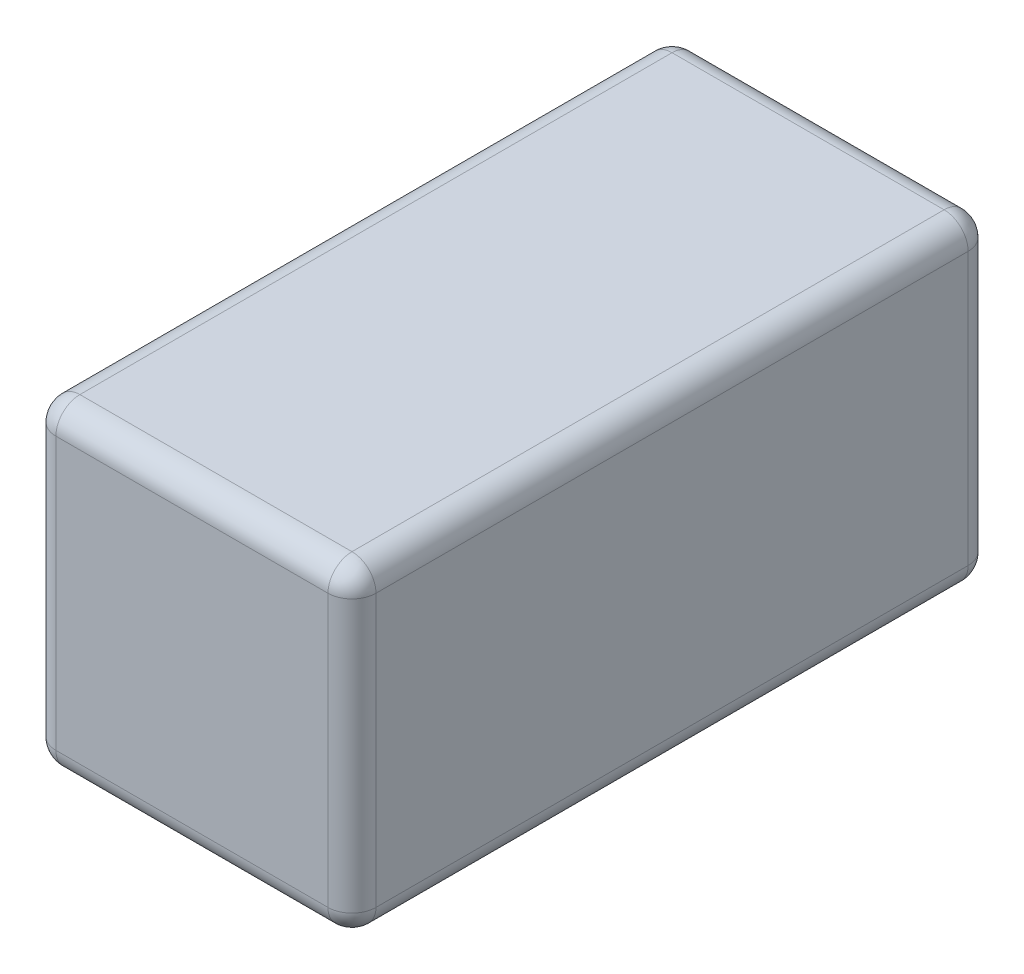
ISO-10303-21;
HEADER;
FILE_DESCRIPTION(('STEP AP214'),'2;1');
FILE_NAME('part.step','',(''),(''),'','','');
FILE_SCHEMA(('AUTOMOTIVE_DESIGN { 1 0 10303 214 1 1 1 1 }'));
ENDSEC;
DATA;
#1=APPLICATION_CONTEXT('core data for automotive mechanical design processes');
#2=APPLICATION_PROTOCOL_DEFINITION('international standard','automotive_design',2000,#1);
#3=PRODUCT_CONTEXT('',#1,'mechanical');
#4=PRODUCT('Part','Part','',(#3));
#5=PRODUCT_RELATED_PRODUCT_CATEGORY('part','',(#4));
#6=PRODUCT_DEFINITION_FORMATION('','',#4);
#7=PRODUCT_DEFINITION_CONTEXT('part definition',#1,'design');
#8=PRODUCT_DEFINITION('design','',#6,#7);
#9=PRODUCT_DEFINITION_SHAPE('','',#8);
#10=(LENGTH_UNIT() NAMED_UNIT(*) SI_UNIT(.MILLI.,.METRE.));
#11=(NAMED_UNIT(*) PLANE_ANGLE_UNIT() SI_UNIT($,.RADIAN.));
#12=(NAMED_UNIT(*) SI_UNIT($,.STERADIAN.) SOLID_ANGLE_UNIT());
#13=UNCERTAINTY_MEASURE_WITH_UNIT(LENGTH_MEASURE(1.E-05),#10,'distance_accuracy_value','');
#14=(GEOMETRIC_REPRESENTATION_CONTEXT(3) GLOBAL_UNCERTAINTY_ASSIGNED_CONTEXT((#13)) GLOBAL_UNIT_ASSIGNED_CONTEXT((#10,
#11,#12)) REPRESENTATION_CONTEXT('',''));
#15=CARTESIAN_POINT('',(0.,0.,0.));
#16=DIRECTION('',(0.,0.,1.));
#17=DIRECTION('',(1.,0.,0.));
#18=AXIS2_PLACEMENT_3D('',#15,#16,#17);
#19=CARTESIAN_POINT('',(0.,0.,8.));
#20=DIRECTION('',(1.,0.,0.));
#21=DIRECTION('',(0.,0.,-1.));
#22=AXIS2_PLACEMENT_3D('',#19,#20,#21);
#23=PLANE('',#22);
#24=DIRECTION('',(0.,0.,-1.));
#25=VECTOR('',#24,1.);
#26=CARTESIAN_POINT('',(0.,0.3,8.));
#27=LINE('',#26,#25);
#28=CARTESIAN_POINT('',(0.,0.3,0.3));
#29=VERTEX_POINT('',#28);
#30=CARTESIAN_POINT('',(0.,0.3,7.7));
#31=VERTEX_POINT('',#30);
#32=EDGE_CURVE('E191',#29,#31,#27,.F.);
#33=ORIENTED_EDGE('',*,*,#32,.T.);
#34=DIRECTION('',(0.,-1.,0.));
#35=VECTOR('',#34,1.);
#36=CARTESIAN_POINT('',(0.,0.,7.7));
#37=LINE('',#36,#35);
#38=CARTESIAN_POINT('',(0.,3.7,7.7));
#39=VERTEX_POINT('',#38);
#40=EDGE_CURVE('E11',#31,#39,#37,.F.);
#41=ORIENTED_EDGE('',*,*,#40,.T.);
#42=DIRECTION('',(0.,0.,-1.));
#43=VECTOR('',#42,1.);
#44=CARTESIAN_POINT('',(0.,3.7,8.));
#45=LINE('',#44,#43);
#46=CARTESIAN_POINT('',(0.,3.7,0.3));
#47=VERTEX_POINT('',#46);
#48=EDGE_CURVE('E230',#39,#47,#45,.T.);
#49=ORIENTED_EDGE('',*,*,#48,.T.);
#50=DIRECTION('',(0.,-1.,0.));
#51=VECTOR('',#50,1.);
#52=CARTESIAN_POINT('',(0.,0.3,0.3));
#53=LINE('',#52,#51);
#54=EDGE_CURVE('E188',#47,#29,#53,.T.);
#55=ORIENTED_EDGE('',*,*,#54,.T.);
#56=EDGE_LOOP('',(#33,#41,#49,#55));
#57=FACE_BOUND('',#56,.T.);
#58=ADVANCED_FACE('F41',(#57),#23,.F.);
#59=CARTESIAN_POINT('',(0.,0.,8.));
#60=DIRECTION('',(0.,1.,0.));
#61=DIRECTION('',(0.,0.,1.));
#62=AXIS2_PLACEMENT_3D('',#59,#60,#61);
#63=PLANE('',#62);
#64=DIRECTION('',(0.,0.,-1.));
#65=VECTOR('',#64,1.);
#66=CARTESIAN_POINT('',(3.7,0.,8.));
#67=LINE('',#66,#65);
#68=CARTESIAN_POINT('',(3.7,0.,0.3));
#69=VERTEX_POINT('',#68);
#70=CARTESIAN_POINT('',(3.7,0.,7.7));
#71=VERTEX_POINT('',#70);
#72=EDGE_CURVE('E145',#69,#71,#67,.F.);
#73=ORIENTED_EDGE('',*,*,#72,.T.);
#74=DIRECTION('',(1.,0.,0.));
#75=VECTOR('',#74,1.);
#76=CARTESIAN_POINT('',(0.,0.,7.7));
#77=LINE('',#76,#75);
#78=CARTESIAN_POINT('',(0.3,0.,7.7));
#79=VERTEX_POINT('',#78);
#80=EDGE_CURVE('E66',#71,#79,#77,.F.);
#81=ORIENTED_EDGE('',*,*,#80,.T.);
#82=DIRECTION('',(0.,0.,-1.));
#83=VECTOR('',#82,1.);
#84=CARTESIAN_POINT('',(0.3,0.,8.));
#85=LINE('',#84,#83);
#86=CARTESIAN_POINT('',(0.3,0.,0.3));
#87=VERTEX_POINT('',#86);
#88=EDGE_CURVE('E184',#79,#87,#85,.T.);
#89=ORIENTED_EDGE('',*,*,#88,.T.);
#90=DIRECTION('',(1.,0.,0.));
#91=VECTOR('',#90,1.);
#92=CARTESIAN_POINT('',(4.,0.,0.3));
#93=LINE('',#92,#91);
#94=EDGE_CURVE('E165',#87,#69,#93,.T.);
#95=ORIENTED_EDGE('',*,*,#94,.T.);
#96=EDGE_LOOP('',(#73,#81,#89,#95));
#97=FACE_BOUND('',#96,.T.);
#98=ADVANCED_FACE('F315',(#97),#63,.F.);
#99=CARTESIAN_POINT('',(4.,0.,8.));
#100=DIRECTION('',(-1.,0.,0.));
#101=DIRECTION('',(0.,0.,1.));
#102=AXIS2_PLACEMENT_3D('',#99,#100,#101);
#103=PLANE('',#102);
#104=DIRECTION('',(0.,0.,-1.));
#105=VECTOR('',#104,1.);
#106=CARTESIAN_POINT('',(4.,3.7,8.));
#107=LINE('',#106,#105);
#108=CARTESIAN_POINT('',(4.,3.7,0.3));
#109=VERTEX_POINT('',#108);
#110=CARTESIAN_POINT('',(4.,3.7,7.7));
#111=VERTEX_POINT('',#110);
#112=EDGE_CURVE('E219',#109,#111,#107,.F.);
#113=ORIENTED_EDGE('',*,*,#112,.T.);
#114=DIRECTION('',(0.,1.,0.));
#115=VECTOR('',#114,1.);
#116=CARTESIAN_POINT('',(4.,0.,7.7));
#117=LINE('',#116,#115);
#118=CARTESIAN_POINT('',(4.,0.3,7.7));
#119=VERTEX_POINT('',#118);
#120=EDGE_CURVE('E141',#111,#119,#117,.F.);
#121=ORIENTED_EDGE('',*,*,#120,.T.);
#122=DIRECTION('',(0.,0.,-1.));
#123=VECTOR('',#122,1.);
#124=CARTESIAN_POINT('',(4.,0.3,8.));
#125=LINE('',#124,#123);
#126=CARTESIAN_POINT('',(4.,0.3,0.3));
#127=VERTEX_POINT('',#126);
#128=EDGE_CURVE('E133',#119,#127,#125,.T.);
#129=ORIENTED_EDGE('',*,*,#128,.T.);
#130=DIRECTION('',(0.,1.,0.));
#131=VECTOR('',#130,1.);
#132=CARTESIAN_POINT('',(4.,4.,0.3));
#133=LINE('',#132,#131);
#134=EDGE_CURVE('E138',#127,#109,#133,.T.);
#135=ORIENTED_EDGE('',*,*,#134,.T.);
#136=EDGE_LOOP('',(#113,#121,#129,#135));
#137=FACE_BOUND('',#136,.T.);
#138=ADVANCED_FACE('F136',(#137),#103,.F.);
#139=CARTESIAN_POINT('',(0.,4.,8.));
#140=DIRECTION('',(0.,-1.,0.));
#141=DIRECTION('',(0.,0.,-1.));
#142=AXIS2_PLACEMENT_3D('',#139,#140,#141);
#143=PLANE('',#142);
#144=DIRECTION('',(0.,0.,-1.));
#145=VECTOR('',#144,1.);
#146=CARTESIAN_POINT('',(0.3,4.,8.));
#147=LINE('',#146,#145);
#148=CARTESIAN_POINT('',(0.3,4.,0.3));
#149=VERTEX_POINT('',#148);
#150=CARTESIAN_POINT('',(0.3,4.,7.7));
#151=VERTEX_POINT('',#150);
#152=EDGE_CURVE('E201',#149,#151,#147,.F.);
#153=ORIENTED_EDGE('',*,*,#152,.T.);
#154=DIRECTION('',(-1.,0.,0.));
#155=VECTOR('',#154,1.);
#156=CARTESIAN_POINT('',(0.,4.,7.7));
#157=LINE('',#156,#155);
#158=CARTESIAN_POINT('',(3.7,4.,7.7));
#159=VERTEX_POINT('',#158);
#160=EDGE_CURVE('E265',#151,#159,#157,.F.);
#161=ORIENTED_EDGE('',*,*,#160,.T.);
#162=DIRECTION('',(0.,0.,-1.));
#163=VECTOR('',#162,1.);
#164=CARTESIAN_POINT('',(3.7,4.,8.));
#165=LINE('',#164,#163);
#166=CARTESIAN_POINT('',(3.7,4.,0.3));
#167=VERTEX_POINT('',#166);
#168=EDGE_CURVE('E216',#159,#167,#165,.T.);
#169=ORIENTED_EDGE('',*,*,#168,.T.);
#170=DIRECTION('',(-1.,0.,0.));
#171=VECTOR('',#170,1.);
#172=CARTESIAN_POINT('',(0.3,4.,0.3));
#173=LINE('',#172,#171);
#174=EDGE_CURVE('E213',#167,#149,#173,.T.);
#175=ORIENTED_EDGE('',*,*,#174,.T.);
#176=EDGE_LOOP('',(#153,#161,#169,#175));
#177=FACE_BOUND('',#176,.T.);
#178=ADVANCED_FACE('F361',(#177),#143,.F.);
#179=CARTESIAN_POINT('',(0.,0.,8.));
#180=DIRECTION('',(0.,0.,-1.));
#181=DIRECTION('',(-1.,0.,0.));
#182=AXIS2_PLACEMENT_3D('',#179,#180,#181);
#183=PLANE('',#182);
#184=DIRECTION('',(0.,1.,0.));
#185=VECTOR('',#184,1.);
#186=CARTESIAN_POINT('',(3.7,0.,8.));
#187=LINE('',#186,#185);
#188=CARTESIAN_POINT('',(3.7,0.3,8.));
#189=VERTEX_POINT('',#188);
#190=CARTESIAN_POINT('',(3.7,3.7,8.));
#191=VERTEX_POINT('',#190);
#192=EDGE_CURVE('E258',#189,#191,#187,.T.);
#193=ORIENTED_EDGE('',*,*,#192,.T.);
#194=DIRECTION('',(-1.,0.,0.));
#195=VECTOR('',#194,1.);
#196=CARTESIAN_POINT('',(0.,3.7,8.));
#197=LINE('',#196,#195);
#198=CARTESIAN_POINT('',(0.3,3.7,8.));
#199=VERTEX_POINT('',#198);
#200=EDGE_CURVE('E261',#191,#199,#197,.T.);
#201=ORIENTED_EDGE('',*,*,#200,.T.);
#202=DIRECTION('',(0.,-1.,0.));
#203=VECTOR('',#202,1.);
#204=CARTESIAN_POINT('',(0.3,0.,8.));
#205=LINE('',#204,#203);
#206=CARTESIAN_POINT('',(0.3,0.3,8.));
#207=VERTEX_POINT('',#206);
#208=EDGE_CURVE('E252',#199,#207,#205,.T.);
#209=ORIENTED_EDGE('',*,*,#208,.T.);
#210=DIRECTION('',(1.,0.,0.));
#211=VECTOR('',#210,1.);
#212=CARTESIAN_POINT('',(0.,0.3,8.));
#213=LINE('',#212,#211);
#214=EDGE_CURVE('E255',#207,#189,#213,.T.);
#215=ORIENTED_EDGE('',*,*,#214,.T.);
#216=EDGE_LOOP('',(#193,#201,#209,#215));
#217=FACE_BOUND('',#216,.T.);
#218=ADVANCED_FACE('F460',(#217),#183,.F.);
#219=CARTESIAN_POINT('',(0.,0.,0.));
#220=DIRECTION('',(0.,0.,-1.));
#221=DIRECTION('',(-1.,0.,0.));
#222=AXIS2_PLACEMENT_3D('',#219,#220,#221);
#223=PLANE('',#222);
#224=DIRECTION('',(0.,-1.,0.));
#225=VECTOR('',#224,1.);
#226=CARTESIAN_POINT('',(0.3,4.,0.));
#227=LINE('',#226,#225);
#228=CARTESIAN_POINT('',(0.3,0.3,0.));
#229=VERTEX_POINT('',#228);
#230=CARTESIAN_POINT('',(0.3,3.7,0.));
#231=VERTEX_POINT('',#230);
#232=EDGE_CURVE('E197',#229,#231,#227,.F.);
#233=ORIENTED_EDGE('',*,*,#232,.T.);
#234=DIRECTION('',(-1.,0.,0.));
#235=VECTOR('',#234,1.);
#236=CARTESIAN_POINT('',(3.7,3.7,0.));
#237=LINE('',#236,#235);
#238=CARTESIAN_POINT('',(3.7,3.7,0.));
#239=VERTEX_POINT('',#238);
#240=EDGE_CURVE('E224',#231,#239,#237,.F.);
#241=ORIENTED_EDGE('',*,*,#240,.T.);
#242=DIRECTION('',(0.,1.,0.));
#243=VECTOR('',#242,1.);
#244=CARTESIAN_POINT('',(3.7,0.3,0.));
#245=LINE('',#244,#243);
#246=CARTESIAN_POINT('',(3.7,0.3,0.));
#247=VERTEX_POINT('',#246);
#248=EDGE_CURVE('E182',#239,#247,#245,.F.);
#249=ORIENTED_EDGE('',*,*,#248,.T.);
#250=DIRECTION('',(1.,0.,0.));
#251=VECTOR('',#250,1.);
#252=CARTESIAN_POINT('',(0.,0.3,0.));
#253=LINE('',#252,#251);
#254=EDGE_CURVE('E171',#247,#229,#253,.F.);
#255=ORIENTED_EDGE('',*,*,#254,.T.);
#256=EDGE_LOOP('',(#233,#241,#249,#255));
#257=FACE_BOUND('',#256,.T.);
#258=ADVANCED_FACE('F324',(#257),#223,.T.);
#259=CARTESIAN_POINT('',(0.,0.3,0.3));
#260=DIRECTION('',(-1.,0.,0.));
#261=DIRECTION('',(0.,0.,1.));
#262=AXIS2_PLACEMENT_3D('',#259,#260,#261);
#263=CYLINDRICAL_SURFACE('',#262,0.3);
#264=ORIENTED_EDGE('',*,*,#94,.F.);
#265=CARTESIAN_POINT('',(0.3,0.3,0.3));
#266=DIRECTION('',(-1.,0.,0.));
#267=DIRECTION('',(0.,0.,1.));
#268=AXIS2_PLACEMENT_3D('',#265,#266,#267);
#269=CIRCLE('',#268,0.3);
#270=EDGE_CURVE('E194',#87,#229,#269,.F.);
#271=ORIENTED_EDGE('',*,*,#270,.T.);
#272=ORIENTED_EDGE('',*,*,#254,.F.);
#273=CARTESIAN_POINT('',(3.7,0.3,0.3));
#274=DIRECTION('',(-1.,0.,0.));
#275=DIRECTION('',(0.,0.,1.));
#276=AXIS2_PLACEMENT_3D('',#273,#274,#275);
#277=CIRCLE('',#276,0.3);
#278=EDGE_CURVE('E161',#247,#69,#277,.T.);
#279=ORIENTED_EDGE('',*,*,#278,.T.);
#280=EDGE_LOOP('',(#264,#271,#272,#279));
#281=FACE_BOUND('',#280,.T.);
#282=ADVANCED_FACE('F320',(#281),#263,.T.);
#283=CARTESIAN_POINT('',(3.7,0.,0.3));
#284=DIRECTION('',(0.,-1.,0.));
#285=DIRECTION('',(0.,0.,-1.));
#286=AXIS2_PLACEMENT_3D('',#283,#284,#285);
#287=CYLINDRICAL_SURFACE('',#286,0.3);
#288=ORIENTED_EDGE('',*,*,#248,.F.);
#289=CARTESIAN_POINT('',(3.7,3.7,0.3));
#290=DIRECTION('',(0.,-1.,0.));
#291=DIRECTION('',(0.,0.,-1.));
#292=AXIS2_PLACEMENT_3D('',#289,#290,#291);
#293=CIRCLE('',#292,0.3);
#294=EDGE_CURVE('E169',#239,#109,#293,.T.);
#295=ORIENTED_EDGE('',*,*,#294,.T.);
#296=ORIENTED_EDGE('',*,*,#134,.F.);
#297=CARTESIAN_POINT('',(3.7,0.3,0.3));
#298=DIRECTION('',(0.,-1.,0.));
#299=DIRECTION('',(0.,0.,-1.));
#300=AXIS2_PLACEMENT_3D('',#297,#298,#299);
#301=CIRCLE('',#300,0.3);
#302=EDGE_CURVE('E155',#247,#127,#301,.T.);
#303=ORIENTED_EDGE('',*,*,#302,.F.);
#304=EDGE_LOOP('',(#288,#295,#296,#303));
#305=FACE_BOUND('',#304,.T.);
#306=ADVANCED_FACE('F167',(#305),#287,.T.);
#307=CARTESIAN_POINT('',(3.7,0.3,0.3));
#308=DIRECTION('',(-1.,0.,0.));
#309=DIRECTION('',(0.,0.,1.));
#310=AXIS2_PLACEMENT_3D('',#307,#308,#309);
#311=SPHERICAL_SURFACE('',#310,0.3);
#312=ORIENTED_EDGE('',*,*,#278,.F.);
#313=ORIENTED_EDGE('',*,*,#302,.T.);
#314=CARTESIAN_POINT('',(3.7,0.3,0.3));
#315=DIRECTION('',(0.,0.,1.));
#316=DIRECTION('',(1.,0.,0.));
#317=AXIS2_PLACEMENT_3D('',#314,#315,#316);
#318=CIRCLE('',#317,0.3);
#319=EDGE_CURVE('E149',#69,#127,#318,.T.);
#320=ORIENTED_EDGE('',*,*,#319,.F.);
#321=EDGE_LOOP('',(#312,#313,#320));
#322=FACE_BOUND('',#321,.T.);
#323=ADVANCED_FACE('F159',(#322),#311,.T.);
#324=CARTESIAN_POINT('',(3.7,0.3,8.));
#325=DIRECTION('',(0.,0.,-1.));
#326=DIRECTION('',(-1.,0.,0.));
#327=AXIS2_PLACEMENT_3D('',#324,#325,#326);
#328=CYLINDRICAL_SURFACE('',#327,0.3);
#329=ORIENTED_EDGE('',*,*,#128,.F.);
#330=CARTESIAN_POINT('',(3.7,0.3,7.7));
#331=DIRECTION('',(0.,0.,-1.));
#332=DIRECTION('',(-1.,0.,0.));
#333=AXIS2_PLACEMENT_3D('',#330,#331,#332);
#334=CIRCLE('',#333,0.3);
#335=EDGE_CURVE('E273',#119,#71,#334,.T.);
#336=ORIENTED_EDGE('',*,*,#335,.T.);
#337=ORIENTED_EDGE('',*,*,#72,.F.);
#338=ORIENTED_EDGE('',*,*,#319,.T.);
#339=EDGE_LOOP('',(#329,#336,#337,#338));
#340=FACE_BOUND('',#339,.T.);
#341=ADVANCED_FACE('F151',(#340),#328,.T.);
#342=CARTESIAN_POINT('',(0.3,0.,0.3));
#343=DIRECTION('',(0.,1.,0.));
#344=DIRECTION('',(0.,0.,1.));
#345=AXIS2_PLACEMENT_3D('',#342,#343,#344);
#346=CYLINDRICAL_SURFACE('',#345,0.3);
#347=ORIENTED_EDGE('',*,*,#54,.F.);
#348=CARTESIAN_POINT('',(0.3,3.7,0.3));
#349=DIRECTION('',(0.,1.,0.));
#350=DIRECTION('',(0.,0.,1.));
#351=AXIS2_PLACEMENT_3D('',#348,#349,#350);
#352=CIRCLE('',#351,0.3);
#353=EDGE_CURVE('E227',#47,#231,#352,.F.);
#354=ORIENTED_EDGE('',*,*,#353,.T.);
#355=ORIENTED_EDGE('',*,*,#232,.F.);
#356=CARTESIAN_POINT('',(0.3,0.3,0.3));
#357=DIRECTION('',(0.,-1.,0.));
#358=DIRECTION('',(0.,0.,-1.));
#359=AXIS2_PLACEMENT_3D('',#356,#357,#358);
#360=CIRCLE('',#359,0.3);
#361=EDGE_CURVE('E156',#29,#229,#360,.T.);
#362=ORIENTED_EDGE('',*,*,#361,.F.);
#363=EDGE_LOOP('',(#347,#354,#355,#362));
#364=FACE_BOUND('',#363,.T.);
#365=ADVANCED_FACE('F329',(#364),#346,.T.);
#366=CARTESIAN_POINT('',(0.3,0.3,0.3));
#367=DIRECTION('',(1.,0.,0.));
#368=DIRECTION('',(0.,0.,-1.));
#369=AXIS2_PLACEMENT_3D('',#366,#367,#368);
#370=SPHERICAL_SURFACE('',#369,0.3);
#371=ORIENTED_EDGE('',*,*,#361,.T.);
#372=ORIENTED_EDGE('',*,*,#270,.F.);
#373=CARTESIAN_POINT('',(0.3,0.3,0.3));
#374=DIRECTION('',(0.,0.,1.));
#375=DIRECTION('',(1.,0.,0.));
#376=AXIS2_PLACEMENT_3D('',#373,#374,#375);
#377=CIRCLE('',#376,0.3);
#378=EDGE_CURVE('E202',#29,#87,#377,.T.);
#379=ORIENTED_EDGE('',*,*,#378,.F.);
#380=EDGE_LOOP('',(#371,#372,#379));
#381=FACE_BOUND('',#380,.T.);
#382=ADVANCED_FACE('F333',(#381),#370,.T.);
#383=CARTESIAN_POINT('',(0.3,0.3,8.));
#384=DIRECTION('',(0.,0.,-1.));
#385=DIRECTION('',(-1.,0.,0.));
#386=AXIS2_PLACEMENT_3D('',#383,#384,#385);
#387=CYLINDRICAL_SURFACE('',#386,0.3);
#388=ORIENTED_EDGE('',*,*,#88,.F.);
#389=CARTESIAN_POINT('',(0.3,0.3,7.7));
#390=DIRECTION('',(0.,0.,-1.));
#391=DIRECTION('',(-1.,0.,0.));
#392=AXIS2_PLACEMENT_3D('',#389,#390,#391);
#393=CIRCLE('',#392,0.3);
#394=EDGE_CURVE('E51',#79,#31,#393,.T.);
#395=ORIENTED_EDGE('',*,*,#394,.T.);
#396=ORIENTED_EDGE('',*,*,#32,.F.);
#397=ORIENTED_EDGE('',*,*,#378,.T.);
#398=EDGE_LOOP('',(#388,#395,#396,#397));
#399=FACE_BOUND('',#398,.T.);
#400=ADVANCED_FACE('F334',(#399),#387,.T.);
#401=CARTESIAN_POINT('',(0.3,3.7,8.));
#402=DIRECTION('',(0.,0.,-1.));
#403=DIRECTION('',(-1.,0.,0.));
#404=AXIS2_PLACEMENT_3D('',#401,#402,#403);
#405=CYLINDRICAL_SURFACE('',#404,0.3);
#406=ORIENTED_EDGE('',*,*,#48,.F.);
#407=CARTESIAN_POINT('',(0.3,3.7,7.7));
#408=DIRECTION('',(0.,0.,-1.));
#409=DIRECTION('',(-1.,0.,0.));
#410=AXIS2_PLACEMENT_3D('',#407,#408,#409);
#411=CIRCLE('',#410,0.3);
#412=EDGE_CURVE('E233',#39,#151,#411,.T.);
#413=ORIENTED_EDGE('',*,*,#412,.T.);
#414=ORIENTED_EDGE('',*,*,#152,.F.);
#415=CARTESIAN_POINT('',(0.3,3.7,0.3));
#416=DIRECTION('',(0.,0.,-1.));
#417=DIRECTION('',(-1.,0.,0.));
#418=AXIS2_PLACEMENT_3D('',#415,#416,#417);
#419=CIRCLE('',#418,0.3);
#420=EDGE_CURVE('E206',#47,#149,#419,.T.);
#421=ORIENTED_EDGE('',*,*,#420,.F.);
#422=EDGE_LOOP('',(#406,#413,#414,#421));
#423=FACE_BOUND('',#422,.T.);
#424=ADVANCED_FACE('F359',(#423),#405,.T.);
#425=CARTESIAN_POINT('',(0.3,3.7,0.3));
#426=DIRECTION('',(0.,-1.,0.));
#427=DIRECTION('',(0.,0.,-1.));
#428=AXIS2_PLACEMENT_3D('',#425,#426,#427);
#429=SPHERICAL_SURFACE('',#428,0.3);
#430=ORIENTED_EDGE('',*,*,#353,.F.);
#431=ORIENTED_EDGE('',*,*,#420,.T.);
#432=CARTESIAN_POINT('',(0.3,3.7,0.3));
#433=DIRECTION('',(1.,0.,0.));
#434=DIRECTION('',(0.,0.,-1.));
#435=AXIS2_PLACEMENT_3D('',#432,#433,#434);
#436=CIRCLE('',#435,0.3);
#437=EDGE_CURVE('E242',#231,#149,#436,.T.);
#438=ORIENTED_EDGE('',*,*,#437,.F.);
#439=EDGE_LOOP('',(#430,#431,#438));
#440=FACE_BOUND('',#439,.T.);
#441=ADVANCED_FACE('F368',(#440),#429,.T.);
#442=CARTESIAN_POINT('',(0.,3.7,0.3));
#443=DIRECTION('',(1.,0.,0.));
#444=DIRECTION('',(0.,0.,-1.));
#445=AXIS2_PLACEMENT_3D('',#442,#443,#444);
#446=CYLINDRICAL_SURFACE('',#445,0.3);
#447=CARTESIAN_POINT('',(3.7,3.7,0.3));
#448=DIRECTION('',(1.,0.,0.));
#449=DIRECTION('',(0.,0.,-1.));
#450=AXIS2_PLACEMENT_3D('',#447,#448,#449);
#451=CIRCLE('',#450,0.3);
#452=EDGE_CURVE('E238',#239,#167,#451,.T.);
#453=ORIENTED_EDGE('',*,*,#452,.F.);
#454=ORIENTED_EDGE('',*,*,#240,.F.);
#455=ORIENTED_EDGE('',*,*,#437,.T.);
#456=ORIENTED_EDGE('',*,*,#174,.F.);
#457=EDGE_LOOP('',(#453,#454,#455,#456));
#458=FACE_BOUND('',#457,.T.);
#459=ADVANCED_FACE('F365',(#458),#446,.T.);
#460=CARTESIAN_POINT('',(3.7,3.7,0.3));
#461=DIRECTION('',(0.,-1.,0.));
#462=DIRECTION('',(0.,0.,-1.));
#463=AXIS2_PLACEMENT_3D('',#460,#461,#462);
#464=SPHERICAL_SURFACE('',#463,0.3);
#465=ORIENTED_EDGE('',*,*,#294,.F.);
#466=ORIENTED_EDGE('',*,*,#452,.T.);
#467=CARTESIAN_POINT('',(3.7,3.7,0.3));
#468=DIRECTION('',(0.,0.,1.));
#469=DIRECTION('',(1.,0.,0.));
#470=AXIS2_PLACEMENT_3D('',#467,#468,#469);
#471=CIRCLE('',#470,0.3);
#472=EDGE_CURVE('E234',#109,#167,#471,.T.);
#473=ORIENTED_EDGE('',*,*,#472,.F.);
#474=EDGE_LOOP('',(#465,#466,#473));
#475=FACE_BOUND('',#474,.T.);
#476=ADVANCED_FACE('F375',(#475),#464,.T.);
#477=CARTESIAN_POINT('',(3.7,3.7,8.));
#478=DIRECTION('',(0.,0.,-1.));
#479=DIRECTION('',(-1.,0.,0.));
#480=AXIS2_PLACEMENT_3D('',#477,#478,#479);
#481=CYLINDRICAL_SURFACE('',#480,0.3);
#482=ORIENTED_EDGE('',*,*,#168,.F.);
#483=CARTESIAN_POINT('',(3.7,3.7,7.7));
#484=DIRECTION('',(0.,0.,-1.));
#485=DIRECTION('',(-1.,0.,0.));
#486=AXIS2_PLACEMENT_3D('',#483,#484,#485);
#487=CIRCLE('',#486,0.3);
#488=EDGE_CURVE('E268',#159,#111,#487,.T.);
#489=ORIENTED_EDGE('',*,*,#488,.T.);
#490=ORIENTED_EDGE('',*,*,#112,.F.);
#491=ORIENTED_EDGE('',*,*,#472,.T.);
#492=EDGE_LOOP('',(#482,#489,#490,#491));
#493=FACE_BOUND('',#492,.T.);
#494=ADVANCED_FACE('F400',(#493),#481,.T.);
#495=CARTESIAN_POINT('',(3.7,0.3,7.7));
#496=DIRECTION('',(0.,0.,-1.));
#497=DIRECTION('',(-1.,0.,0.));
#498=AXIS2_PLACEMENT_3D('',#495,#496,#497);
#499=SPHERICAL_SURFACE('',#498,0.3);
#500=CARTESIAN_POINT('',(3.7,0.3,7.7));
#501=DIRECTION('',(-1.,0.,0.));
#502=DIRECTION('',(0.,0.,1.));
#503=AXIS2_PLACEMENT_3D('',#500,#501,#502);
#504=CIRCLE('',#503,0.3);
#505=EDGE_CURVE('E301',#71,#189,#504,.T.);
#506=ORIENTED_EDGE('',*,*,#505,.F.);
#507=ORIENTED_EDGE('',*,*,#335,.F.);
#508=CARTESIAN_POINT('',(3.7,0.3,7.7));
#509=DIRECTION('',(0.,1.,0.));
#510=DIRECTION('',(0.,0.,1.));
#511=AXIS2_PLACEMENT_3D('',#508,#509,#510);
#512=CIRCLE('',#511,0.3);
#513=EDGE_CURVE('E45',#189,#119,#512,.T.);
#514=ORIENTED_EDGE('',*,*,#513,.F.);
#515=EDGE_LOOP('',(#506,#507,#514));
#516=FACE_BOUND('',#515,.T.);
#517=ADVANCED_FACE('F43',(#516),#499,.T.);
#518=CARTESIAN_POINT('',(3.7,0.,7.7));
#519=DIRECTION('',(0.,1.,0.));
#520=DIRECTION('',(0.,0.,1.));
#521=AXIS2_PLACEMENT_3D('',#518,#519,#520);
#522=CYLINDRICAL_SURFACE('',#521,0.3);
#523=ORIENTED_EDGE('',*,*,#513,.T.);
#524=ORIENTED_EDGE('',*,*,#120,.F.);
#525=CARTESIAN_POINT('',(3.7,3.7,7.7));
#526=DIRECTION('',(0.,1.,0.));
#527=DIRECTION('',(0.,0.,1.));
#528=AXIS2_PLACEMENT_3D('',#525,#526,#527);
#529=CIRCLE('',#528,0.3);
#530=EDGE_CURVE('E298',#191,#111,#529,.T.);
#531=ORIENTED_EDGE('',*,*,#530,.F.);
#532=ORIENTED_EDGE('',*,*,#192,.F.);
#533=EDGE_LOOP('',(#523,#524,#531,#532));
#534=FACE_BOUND('',#533,.T.);
#535=ADVANCED_FACE('F312',(#534),#522,.T.);
#536=CARTESIAN_POINT('',(0.,0.3,7.7));
#537=DIRECTION('',(1.,0.,0.));
#538=DIRECTION('',(0.,0.,-1.));
#539=AXIS2_PLACEMENT_3D('',#536,#537,#538);
#540=CYLINDRICAL_SURFACE('',#539,0.3);
#541=ORIENTED_EDGE('',*,*,#505,.T.);
#542=ORIENTED_EDGE('',*,*,#214,.F.);
#543=CARTESIAN_POINT('',(0.3,0.3,7.7));
#544=DIRECTION('',(-1.,0.,0.));
#545=DIRECTION('',(0.,0.,1.));
#546=AXIS2_PLACEMENT_3D('',#543,#544,#545);
#547=CIRCLE('',#546,0.3);
#548=EDGE_CURVE('E294',#79,#207,#547,.T.);
#549=ORIENTED_EDGE('',*,*,#548,.F.);
#550=ORIENTED_EDGE('',*,*,#80,.F.);
#551=EDGE_LOOP('',(#541,#542,#549,#550));
#552=FACE_BOUND('',#551,.T.);
#553=ADVANCED_FACE('F413',(#552),#540,.T.);
#554=CARTESIAN_POINT('',(3.7,3.7,7.7));
#555=DIRECTION('',(0.,0.,-1.));
#556=DIRECTION('',(-1.,0.,0.));
#557=AXIS2_PLACEMENT_3D('',#554,#555,#556);
#558=SPHERICAL_SURFACE('',#557,0.3);
#559=ORIENTED_EDGE('',*,*,#530,.T.);
#560=ORIENTED_EDGE('',*,*,#488,.F.);
#561=CARTESIAN_POINT('',(3.7,3.7,7.7));
#562=DIRECTION('',(-1.,0.,0.));
#563=DIRECTION('',(0.,0.,1.));
#564=AXIS2_PLACEMENT_3D('',#561,#562,#563);
#565=CIRCLE('',#564,0.3);
#566=EDGE_CURVE('E290',#191,#159,#565,.T.);
#567=ORIENTED_EDGE('',*,*,#566,.F.);
#568=EDGE_LOOP('',(#559,#560,#567));
#569=FACE_BOUND('',#568,.T.);
#570=ADVANCED_FACE('F411',(#569),#558,.T.);
#571=CARTESIAN_POINT('',(0.3,0.3,7.7));
#572=DIRECTION('',(0.,0.,-1.));
#573=DIRECTION('',(-1.,0.,0.));
#574=AXIS2_PLACEMENT_3D('',#571,#572,#573);
#575=SPHERICAL_SURFACE('',#574,0.3);
#576=ORIENTED_EDGE('',*,*,#394,.F.);
#577=ORIENTED_EDGE('',*,*,#548,.T.);
#578=CARTESIAN_POINT('',(0.3,0.3,7.7));
#579=DIRECTION('',(0.,1.,0.));
#580=DIRECTION('',(0.,0.,1.));
#581=AXIS2_PLACEMENT_3D('',#578,#579,#580);
#582=CIRCLE('',#581,0.3);
#583=EDGE_CURVE('E286',#31,#207,#582,.T.);
#584=ORIENTED_EDGE('',*,*,#583,.F.);
#585=EDGE_LOOP('',(#576,#577,#584));
#586=FACE_BOUND('',#585,.T.);
#587=ADVANCED_FACE('F341',(#586),#575,.T.);
#588=CARTESIAN_POINT('',(0.,3.7,7.7));
#589=DIRECTION('',(-1.,0.,0.));
#590=DIRECTION('',(0.,0.,1.));
#591=AXIS2_PLACEMENT_3D('',#588,#589,#590);
#592=CYLINDRICAL_SURFACE('',#591,0.3);
#593=ORIENTED_EDGE('',*,*,#566,.T.);
#594=ORIENTED_EDGE('',*,*,#160,.F.);
#595=CARTESIAN_POINT('',(0.3,3.7,7.7));
#596=DIRECTION('',(-1.,0.,0.));
#597=DIRECTION('',(0.,0.,1.));
#598=AXIS2_PLACEMENT_3D('',#595,#596,#597);
#599=CIRCLE('',#598,0.3);
#600=EDGE_CURVE('E283',#199,#151,#599,.T.);
#601=ORIENTED_EDGE('',*,*,#600,.F.);
#602=ORIENTED_EDGE('',*,*,#200,.F.);
#603=EDGE_LOOP('',(#593,#594,#601,#602));
#604=FACE_BOUND('',#603,.T.);
#605=ADVANCED_FACE('F353',(#604),#592,.T.);
#606=CARTESIAN_POINT('',(0.3,0.,7.7));
#607=DIRECTION('',(0.,-1.,0.));
#608=DIRECTION('',(0.,0.,-1.));
#609=AXIS2_PLACEMENT_3D('',#606,#607,#608);
#610=CYLINDRICAL_SURFACE('',#609,0.3);
#611=ORIENTED_EDGE('',*,*,#583,.T.);
#612=ORIENTED_EDGE('',*,*,#208,.F.);
#613=CARTESIAN_POINT('',(0.3,3.7,7.7));
#614=DIRECTION('',(0.,1.,0.));
#615=DIRECTION('',(0.,0.,1.));
#616=AXIS2_PLACEMENT_3D('',#613,#614,#615);
#617=CIRCLE('',#616,0.3);
#618=EDGE_CURVE('E280',#39,#199,#617,.T.);
#619=ORIENTED_EDGE('',*,*,#618,.F.);
#620=ORIENTED_EDGE('',*,*,#40,.F.);
#621=EDGE_LOOP('',(#611,#612,#619,#620));
#622=FACE_BOUND('',#621,.T.);
#623=ADVANCED_FACE('F345',(#622),#610,.T.);
#624=CARTESIAN_POINT('',(0.3,3.7,7.7));
#625=DIRECTION('',(0.,0.,-1.));
#626=DIRECTION('',(-1.,0.,0.));
#627=AXIS2_PLACEMENT_3D('',#624,#625,#626);
#628=SPHERICAL_SURFACE('',#627,0.3);
#629=ORIENTED_EDGE('',*,*,#600,.T.);
#630=ORIENTED_EDGE('',*,*,#412,.F.);
#631=ORIENTED_EDGE('',*,*,#618,.T.);
#632=EDGE_LOOP('',(#629,#630,#631));
#633=FACE_BOUND('',#632,.T.);
#634=ADVANCED_FACE('F349',(#633),#628,.T.);
#635=CLOSED_SHELL('',(#58,#98,#138,#178,#218,#258,#282,#306,#323,#341,#365,#382,#400,#424,#441,
#459,#476,#494,#517,#535,#553,#570,#587,#605,#623,#634));
#636=MANIFOLD_SOLID_BREP('B2',#635);
#637=ADVANCED_BREP_SHAPE_REPRESENTATION('',(#18,#636),#14);
#638=SHAPE_DEFINITION_REPRESENTATION(#9,#637);
ENDSEC;
END-ISO-10303-21;
